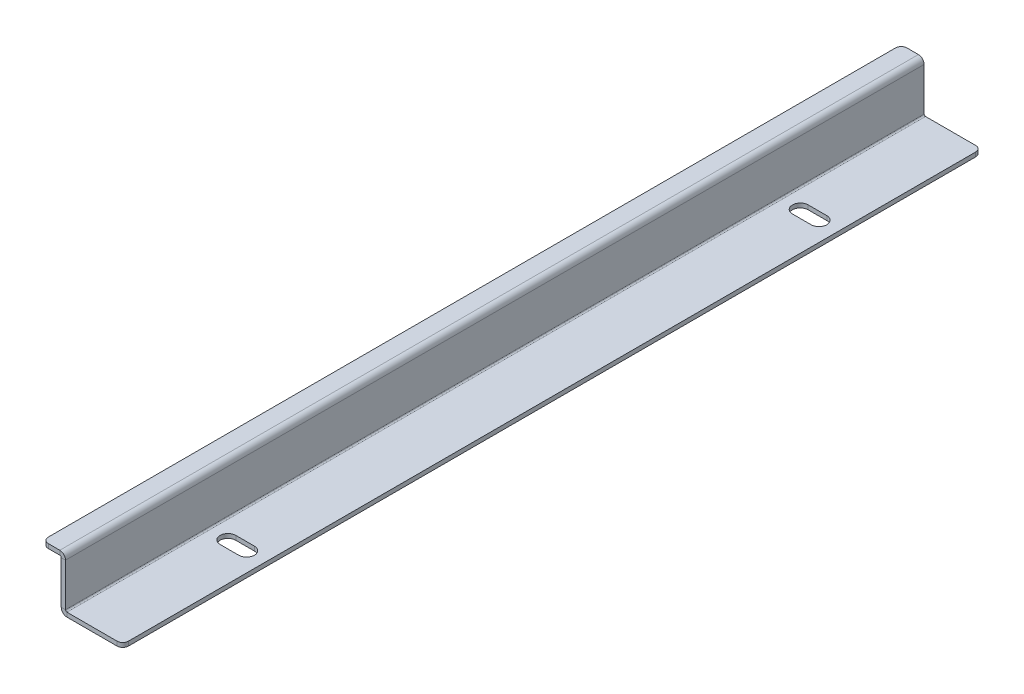
ISO-10303-21;
HEADER;
FILE_DESCRIPTION(('STEP AP214'),'2;1');
FILE_NAME('part.step','',(''),(''),'','','');
FILE_SCHEMA(('AUTOMOTIVE_DESIGN { 1 0 10303 214 1 1 1 1 }'));
ENDSEC;
DATA;
#1=APPLICATION_CONTEXT('core data for automotive mechanical design processes');
#2=APPLICATION_PROTOCOL_DEFINITION('international standard','automotive_design',2000,#1);
#3=PRODUCT_CONTEXT('',#1,'mechanical');
#4=PRODUCT('Part','Part','',(#3));
#5=PRODUCT_RELATED_PRODUCT_CATEGORY('part','',(#4));
#6=PRODUCT_DEFINITION_FORMATION('','',#4);
#7=PRODUCT_DEFINITION_CONTEXT('part definition',#1,'design');
#8=PRODUCT_DEFINITION('design','',#6,#7);
#9=PRODUCT_DEFINITION_SHAPE('','',#8);
#10=(LENGTH_UNIT() NAMED_UNIT(*) SI_UNIT(.MILLI.,.METRE.));
#11=(NAMED_UNIT(*) PLANE_ANGLE_UNIT() SI_UNIT($,.RADIAN.));
#12=(NAMED_UNIT(*) SI_UNIT($,.STERADIAN.) SOLID_ANGLE_UNIT());
#13=UNCERTAINTY_MEASURE_WITH_UNIT(LENGTH_MEASURE(1.E-05),#10,'distance_accuracy_value','');
#14=(GEOMETRIC_REPRESENTATION_CONTEXT(3) GLOBAL_UNCERTAINTY_ASSIGNED_CONTEXT((#13)) GLOBAL_UNIT_ASSIGNED_CONTEXT((#10,
#11,#12)) REPRESENTATION_CONTEXT('',''));
#15=CARTESIAN_POINT('',(0.,0.,0.));
#16=DIRECTION('',(0.,0.,1.));
#17=DIRECTION('',(1.,0.,0.));
#18=AXIS2_PLACEMENT_3D('',#15,#16,#17);
#19=CARTESIAN_POINT('',(0.,-601.6199880024,150.));
#20=DIRECTION('',(-1.,0.,0.));
#21=DIRECTION('',(0.,0.,1.));
#22=AXIS2_PLACEMENT_3D('',#19,#20,#21);
#23=PLANE('',#22);
#24=DIRECTION('',(0.,1.,0.));
#25=VECTOR('',#24,1.);
#26=CARTESIAN_POINT('',(0.,-601.6199880024,148.));
#27=LINE('',#26,#25);
#28=CARTESIAN_POINT('',(0.,-1.50000000000002,148.));
#29=VERTEX_POINT('',#28);
#30=CARTESIAN_POINT('',(0.,0.,148.));
#31=VERTEX_POINT('',#30);
#32=EDGE_CURVE('E425',#29,#31,#27,.T.);
#33=ORIENTED_EDGE('',*,*,#32,.T.);
#34=DIRECTION('',(0.,0.,1.));
#35=VECTOR('',#34,1.);
#36=CARTESIAN_POINT('',(0.,0.,150.));
#37=LINE('',#36,#35);
#38=CARTESIAN_POINT('',(0.,0.,-148.));
#39=VERTEX_POINT('',#38);
#40=EDGE_CURVE('E400',#39,#31,#37,.T.);
#41=ORIENTED_EDGE('',*,*,#40,.F.);
#42=DIRECTION('',(0.,1.,0.));
#43=VECTOR('',#42,1.);
#44=CARTESIAN_POINT('',(0.,-601.6199880024,-148.));
#45=LINE('',#44,#43);
#46=CARTESIAN_POINT('',(0.,-1.50000000000002,-148.));
#47=VERTEX_POINT('',#46);
#48=EDGE_CURVE('E424',#47,#39,#45,.T.);
#49=ORIENTED_EDGE('',*,*,#48,.F.);
#50=DIRECTION('',(0.,0.,1.));
#51=VECTOR('',#50,1.);
#52=CARTESIAN_POINT('',(0.,-1.50000000000001,150.));
#53=LINE('',#52,#51);
#54=EDGE_CURVE('E113',#47,#29,#53,.T.);
#55=ORIENTED_EDGE('',*,*,#54,.T.);
#56=EDGE_LOOP('',(#33,#41,#49,#55));
#57=FACE_BOUND('',#56,.T.);
#58=ADVANCED_FACE('F53',(#57),#23,.T.);
#59=CARTESIAN_POINT('',(2.00000000000001,-601.6199880024,-148.));
#60=DIRECTION('',(0.,1.,0.));
#61=DIRECTION('',(0.,0.,1.));
#62=AXIS2_PLACEMENT_3D('',#59,#60,#61);
#63=CYLINDRICAL_SURFACE('',#62,2.);
#64=ORIENTED_EDGE('',*,*,#48,.T.);
#65=CARTESIAN_POINT('',(2.00000000000001,0.,-148.));
#66=DIRECTION('',(0.,1.,0.));
#67=DIRECTION('',(0.,0.,1.));
#68=AXIS2_PLACEMENT_3D('',#65,#66,#67);
#69=CIRCLE('',#68,2.);
#70=CARTESIAN_POINT('',(2.00000000000001,0.,-150.));
#71=VERTEX_POINT('',#70);
#72=EDGE_CURVE('E396',#71,#39,#69,.T.);
#73=ORIENTED_EDGE('',*,*,#72,.F.);
#74=DIRECTION('',(0.,1.,0.));
#75=VECTOR('',#74,1.);
#76=CARTESIAN_POINT('',(2.00000000000001,-601.6199880024,-150.));
#77=LINE('',#76,#75);
#78=CARTESIAN_POINT('',(2.00000000000001,-1.50000000000002,-150.));
#79=VERTEX_POINT('',#78);
#80=EDGE_CURVE('E438',#79,#71,#77,.T.);
#81=ORIENTED_EDGE('',*,*,#80,.F.);
#82=CARTESIAN_POINT('',(2.00000000000001,-1.50000000000001,-148.));
#83=DIRECTION('',(0.,1.,0.));
#84=DIRECTION('',(0.,0.,1.));
#85=AXIS2_PLACEMENT_3D('',#82,#83,#84);
#86=CIRCLE('',#85,2.);
#87=EDGE_CURVE('E105',#79,#47,#86,.T.);
#88=ORIENTED_EDGE('',*,*,#87,.T.);
#89=EDGE_LOOP('',(#64,#73,#81,#88));
#90=FACE_BOUND('',#89,.T.);
#91=ADVANCED_FACE('F463',(#90),#63,.T.);
#92=CARTESIAN_POINT('',(2.00000000000001,-601.6199880024,148.));
#93=DIRECTION('',(0.,1.,0.));
#94=DIRECTION('',(0.,0.,1.));
#95=AXIS2_PLACEMENT_3D('',#92,#93,#94);
#96=CYLINDRICAL_SURFACE('',#95,2.);
#97=DIRECTION('',(0.,1.,0.));
#98=VECTOR('',#97,1.);
#99=CARTESIAN_POINT('',(2.00000000000001,-601.6199880024,150.));
#100=LINE('',#99,#98);
#101=CARTESIAN_POINT('',(2.00000000000001,-1.50000000000002,150.));
#102=VERTEX_POINT('',#101);
#103=CARTESIAN_POINT('',(2.00000000000001,0.,150.));
#104=VERTEX_POINT('',#103);
#105=EDGE_CURVE('E461',#102,#104,#100,.T.);
#106=ORIENTED_EDGE('',*,*,#105,.T.);
#107=CARTESIAN_POINT('',(2.00000000000001,0.,148.));
#108=DIRECTION('',(0.,-1.,0.));
#109=DIRECTION('',(0.,0.,-1.));
#110=AXIS2_PLACEMENT_3D('',#107,#108,#109);
#111=CIRCLE('',#110,2.);
#112=EDGE_CURVE('E445',#31,#104,#111,.F.);
#113=ORIENTED_EDGE('',*,*,#112,.F.);
#114=ORIENTED_EDGE('',*,*,#32,.F.);
#115=CARTESIAN_POINT('',(2.00000000000001,-1.50000000000001,148.));
#116=DIRECTION('',(0.,-1.,0.));
#117=DIRECTION('',(0.,0.,-1.));
#118=AXIS2_PLACEMENT_3D('',#115,#116,#117);
#119=CIRCLE('',#118,2.);
#120=EDGE_CURVE('E749',#29,#102,#119,.F.);
#121=ORIENTED_EDGE('',*,*,#120,.T.);
#122=EDGE_LOOP('',(#106,#113,#114,#121));
#123=FACE_BOUND('',#122,.T.);
#124=ADVANCED_FACE('F458',(#123),#96,.T.);
#125=CARTESIAN_POINT('',(6.50000000000001,-601.6199880024,150.));
#126=DIRECTION('',(0.,0.,1.));
#127=DIRECTION('',(0.,-1.,0.));
#128=AXIS2_PLACEMENT_3D('',#125,#126,#127);
#129=PLANE('',#128);
#130=DIRECTION('',(0.,1.,0.));
#131=VECTOR('',#130,1.);
#132=CARTESIAN_POINT('',(6.00000000000001,-601.6199880024,150.));
#133=LINE('',#132,#131);
#134=CARTESIAN_POINT('',(6.,-1.5,150.));
#135=VERTEX_POINT('',#134);
#136=CARTESIAN_POINT('',(6.,0.,150.));
#137=VERTEX_POINT('',#136);
#138=EDGE_CURVE('E746',#135,#137,#133,.T.);
#139=ORIENTED_EDGE('',*,*,#138,.T.);
#140=DIRECTION('',(1.,0.,0.));
#141=VECTOR('',#140,1.);
#142=CARTESIAN_POINT('',(6.50000000000001,0.,150.));
#143=LINE('',#142,#141);
#144=EDGE_CURVE('E411',#137,#104,#143,.F.);
#145=ORIENTED_EDGE('',*,*,#144,.T.);
#146=ORIENTED_EDGE('',*,*,#105,.F.);
#147=DIRECTION('',(1.,0.,0.));
#148=VECTOR('',#147,1.);
#149=CARTESIAN_POINT('',(6.50000000000001,-1.50000000000001,150.));
#150=LINE('',#149,#148);
#151=EDGE_CURVE('E406',#102,#135,#150,.T.);
#152=ORIENTED_EDGE('',*,*,#151,.T.);
#153=EDGE_LOOP('',(#139,#145,#146,#152));
#154=FACE_BOUND('',#153,.T.);
#155=ADVANCED_FACE('F474',(#154),#129,.T.);
#156=CARTESIAN_POINT('',(0.,0.,150.));
#157=DIRECTION('',(0.,1.,0.));
#158=DIRECTION('',(0.,0.,1.));
#159=AXIS2_PLACEMENT_3D('',#156,#157,#158);
#160=PLANE('',#159);
#161=ORIENTED_EDGE('',*,*,#144,.F.);
#162=DIRECTION('',(0.,0.,1.));
#163=VECTOR('',#162,1.);
#164=CARTESIAN_POINT('',(6.00000000000001,0.,150.));
#165=LINE('',#164,#163);
#166=CARTESIAN_POINT('',(6.00000000000001,0.,-150.));
#167=VERTEX_POINT('',#166);
#168=EDGE_CURVE('E401',#137,#167,#165,.F.);
#169=ORIENTED_EDGE('',*,*,#168,.T.);
#170=DIRECTION('',(-1.,0.,0.));
#171=VECTOR('',#170,1.);
#172=CARTESIAN_POINT('',(8.50000000000001,0.,-150.));
#173=LINE('',#172,#171);
#174=EDGE_CURVE('E65',#71,#167,#173,.F.);
#175=ORIENTED_EDGE('',*,*,#174,.F.);
#176=ORIENTED_EDGE('',*,*,#72,.T.);
#177=ORIENTED_EDGE('',*,*,#40,.T.);
#178=ORIENTED_EDGE('',*,*,#112,.T.);
#179=EDGE_LOOP('',(#161,#169,#175,#176,#177,#178));
#180=FACE_BOUND('',#179,.T.);
#181=ADVANCED_FACE('F455',(#180),#160,.T.);
#182=CARTESIAN_POINT('',(8.50000000000001,-601.6199880024,-150.));
#183=DIRECTION('',(0.,0.,-1.));
#184=DIRECTION('',(0.,1.,0.));
#185=AXIS2_PLACEMENT_3D('',#182,#183,#184);
#186=PLANE('',#185);
#187=ORIENTED_EDGE('',*,*,#80,.T.);
#188=ORIENTED_EDGE('',*,*,#174,.T.);
#189=DIRECTION('',(0.,1.,0.));
#190=VECTOR('',#189,1.);
#191=CARTESIAN_POINT('',(6.00000000000001,-601.6199880024,-150.));
#192=LINE('',#191,#190);
#193=CARTESIAN_POINT('',(6.00000000000001,-1.5,-150.));
#194=VERTEX_POINT('',#193);
#195=EDGE_CURVE('E297',#194,#167,#192,.T.);
#196=ORIENTED_EDGE('',*,*,#195,.F.);
#197=DIRECTION('',(-1.,0.,0.));
#198=VECTOR('',#197,1.);
#199=CARTESIAN_POINT('',(8.50000000000001,-1.50000000000001,-150.));
#200=LINE('',#199,#198);
#201=EDGE_CURVE('E12',#194,#79,#200,.T.);
#202=ORIENTED_EDGE('',*,*,#201,.T.);
#203=EDGE_LOOP('',(#187,#188,#196,#202));
#204=FACE_BOUND('',#203,.T.);
#205=ADVANCED_FACE('F437',(#204),#186,.T.);
#206=CARTESIAN_POINT('',(0.,-1.50000000000001,150.));
#207=DIRECTION('',(0.,1.,0.));
#208=DIRECTION('',(0.,0.,1.));
#209=AXIS2_PLACEMENT_3D('',#206,#207,#208);
#210=PLANE('',#209);
#211=ORIENTED_EDGE('',*,*,#151,.F.);
#212=ORIENTED_EDGE('',*,*,#120,.F.);
#213=ORIENTED_EDGE('',*,*,#54,.F.);
#214=ORIENTED_EDGE('',*,*,#87,.F.);
#215=ORIENTED_EDGE('',*,*,#201,.F.);
#216=DIRECTION('',(0.,0.,1.));
#217=VECTOR('',#216,1.);
#218=CARTESIAN_POINT('',(6.00000000000001,-1.50000000000001,150.));
#219=LINE('',#218,#217);
#220=EDGE_CURVE('E58',#135,#194,#219,.F.);
#221=ORIENTED_EDGE('',*,*,#220,.F.);
#222=EDGE_LOOP('',(#211,#212,#213,#214,#215,#221));
#223=FACE_BOUND('',#222,.T.);
#224=ADVANCED_FACE('F56',(#223),#210,.F.);
#225=CARTESIAN_POINT('',(6.50000000000001,0.,150.));
#226=DIRECTION('',(1.,0.,0.));
#227=DIRECTION('',(0.,0.,-1.));
#228=AXIS2_PLACEMENT_3D('',#225,#226,#227);
#229=PLANE('',#228);
#230=DIRECTION('',(0.,1.,0.));
#231=VECTOR('',#230,1.);
#232=CARTESIAN_POINT('',(6.5,-17.,-150.));
#233=LINE('',#232,#231);
#234=CARTESIAN_POINT('',(6.5,-17.,-150.));
#235=VERTEX_POINT('',#234);
#236=CARTESIAN_POINT('',(6.50000000000001,-2.,-150.));
#237=VERTEX_POINT('',#236);
#238=EDGE_CURVE('E304',#235,#237,#233,.T.);
#239=ORIENTED_EDGE('',*,*,#238,.F.);
#240=DIRECTION('',(0.,0.,-1.));
#241=VECTOR('',#240,1.);
#242=CARTESIAN_POINT('',(6.5,-17.,150.));
#243=LINE('',#242,#241);
#244=CARTESIAN_POINT('',(6.5,-17.,150.));
#245=VERTEX_POINT('',#244);
#246=EDGE_CURVE('E513',#245,#235,#243,.T.);
#247=ORIENTED_EDGE('',*,*,#246,.F.);
#248=DIRECTION('',(0.,1.,0.));
#249=VECTOR('',#248,1.);
#250=CARTESIAN_POINT('',(6.5,-17.,150.));
#251=LINE('',#250,#249);
#252=CARTESIAN_POINT('',(6.50000000000001,-2.,150.));
#253=VERTEX_POINT('',#252);
#254=EDGE_CURVE('E317',#253,#245,#251,.F.);
#255=ORIENTED_EDGE('',*,*,#254,.F.);
#256=DIRECTION('',(0.,0.,-1.));
#257=VECTOR('',#256,1.);
#258=CARTESIAN_POINT('',(6.50000000000001,-2.,150.));
#259=LINE('',#258,#257);
#260=EDGE_CURVE('E314',#237,#253,#259,.F.);
#261=ORIENTED_EDGE('',*,*,#260,.F.);
#262=EDGE_LOOP('',(#239,#247,#255,#261));
#263=FACE_BOUND('',#262,.T.);
#264=ADVANCED_FACE('F485',(#263),#229,.F.);
#265=CARTESIAN_POINT('',(607.249531835024,-17.,-150.));
#266=DIRECTION('',(0.,0.,-1.));
#267=DIRECTION('',(0.,1.,0.));
#268=AXIS2_PLACEMENT_3D('',#265,#266,#267);
#269=PLANE('',#268);
#270=ORIENTED_EDGE('',*,*,#238,.T.);
#271=DIRECTION('',(-1.,0.,0.));
#272=VECTOR('',#271,1.);
#273=CARTESIAN_POINT('',(607.249531835024,-2.,-150.));
#274=LINE('',#273,#272);
#275=CARTESIAN_POINT('',(8.00000000000001,-2.00000000000001,-150.));
#276=VERTEX_POINT('',#275);
#277=EDGE_CURVE('E295',#276,#237,#274,.T.);
#278=ORIENTED_EDGE('',*,*,#277,.F.);
#279=DIRECTION('',(0.,1.,0.));
#280=VECTOR('',#279,1.);
#281=CARTESIAN_POINT('',(8.,-17.,-150.));
#282=LINE('',#281,#280);
#283=CARTESIAN_POINT('',(8.,-17.,-150.));
#284=VERTEX_POINT('',#283);
#285=EDGE_CURVE('E125',#276,#284,#282,.F.);
#286=ORIENTED_EDGE('',*,*,#285,.T.);
#287=DIRECTION('',(-1.,0.,0.));
#288=VECTOR('',#287,1.);
#289=CARTESIAN_POINT('',(607.249531835024,-17.,-150.));
#290=LINE('',#289,#288);
#291=EDGE_CURVE('E520',#284,#235,#290,.T.);
#292=ORIENTED_EDGE('',*,*,#291,.T.);
#293=EDGE_LOOP('',(#270,#278,#286,#292));
#294=FACE_BOUND('',#293,.T.);
#295=ADVANCED_FACE('F302',(#294),#269,.T.);
#296=CARTESIAN_POINT('',(607.249531835024,-17.,150.));
#297=DIRECTION('',(0.,0.,1.));
#298=DIRECTION('',(0.,-1.,0.));
#299=AXIS2_PLACEMENT_3D('',#296,#297,#298);
#300=PLANE('',#299);
#301=ORIENTED_EDGE('',*,*,#254,.T.);
#302=DIRECTION('',(-1.,0.,0.));
#303=VECTOR('',#302,1.);
#304=CARTESIAN_POINT('',(607.249531835024,-17.,150.));
#305=LINE('',#304,#303);
#306=CARTESIAN_POINT('',(8.,-17.,150.));
#307=VERTEX_POINT('',#306);
#308=EDGE_CURVE('E511',#307,#245,#305,.T.);
#309=ORIENTED_EDGE('',*,*,#308,.F.);
#310=DIRECTION('',(0.,1.,0.));
#311=VECTOR('',#310,1.);
#312=CARTESIAN_POINT('',(8.,-17.,150.));
#313=LINE('',#312,#311);
#314=CARTESIAN_POINT('',(8.00000000000001,-2.,150.));
#315=VERTEX_POINT('',#314);
#316=EDGE_CURVE('E291',#307,#315,#313,.T.);
#317=ORIENTED_EDGE('',*,*,#316,.T.);
#318=DIRECTION('',(-1.,0.,0.));
#319=VECTOR('',#318,1.);
#320=CARTESIAN_POINT('',(607.249531835024,-2.,150.));
#321=LINE('',#320,#319);
#322=EDGE_CURVE('E307',#315,#253,#321,.T.);
#323=ORIENTED_EDGE('',*,*,#322,.T.);
#324=EDGE_LOOP('',(#301,#309,#317,#323));
#325=FACE_BOUND('',#324,.T.);
#326=ADVANCED_FACE('F494',(#325),#300,.T.);
#327=CARTESIAN_POINT('',(8.,0.,150.));
#328=DIRECTION('',(1.,0.,0.));
#329=DIRECTION('',(0.,0.,-1.));
#330=AXIS2_PLACEMENT_3D('',#327,#328,#329);
#331=PLANE('',#330);
#332=ORIENTED_EDGE('',*,*,#285,.F.);
#333=DIRECTION('',(0.,0.,-1.));
#334=VECTOR('',#333,1.);
#335=CARTESIAN_POINT('',(8.,-2.,150.));
#336=LINE('',#335,#334);
#337=EDGE_CURVE('E280',#315,#276,#336,.T.);
#338=ORIENTED_EDGE('',*,*,#337,.F.);
#339=ORIENTED_EDGE('',*,*,#316,.F.);
#340=DIRECTION('',(0.,0.,-1.));
#341=VECTOR('',#340,1.);
#342=CARTESIAN_POINT('',(8.,-17.,150.));
#343=LINE('',#342,#341);
#344=EDGE_CURVE('E311',#307,#284,#343,.T.);
#345=ORIENTED_EDGE('',*,*,#344,.T.);
#346=EDGE_LOOP('',(#332,#338,#339,#345));
#347=FACE_BOUND('',#346,.T.);
#348=ADVANCED_FACE('F309',(#347),#331,.T.);
#349=CARTESIAN_POINT('',(28.,582.266164023887,150.));
#350=DIRECTION('',(-1.,0.,0.));
#351=DIRECTION('',(0.,0.,1.));
#352=AXIS2_PLACEMENT_3D('',#349,#350,#351);
#353=PLANE('',#352);
#354=DIRECTION('',(0.,-1.,0.));
#355=VECTOR('',#354,1.);
#356=CARTESIAN_POINT('',(28.,582.266164023887,148.));
#357=LINE('',#356,#355);
#358=CARTESIAN_POINT('',(28.,-17.5,148.));
#359=VERTEX_POINT('',#358);
#360=CARTESIAN_POINT('',(28.,-19.,148.));
#361=VERTEX_POINT('',#360);
#362=EDGE_CURVE('E543',#359,#361,#357,.T.);
#363=ORIENTED_EDGE('',*,*,#362,.T.);
#364=DIRECTION('',(0.,0.,-1.));
#365=VECTOR('',#364,1.);
#366=CARTESIAN_POINT('',(28.,-19.,150.));
#367=LINE('',#366,#365);
#368=CARTESIAN_POINT('',(28.,-19.,-148.));
#369=VERTEX_POINT('',#368);
#370=EDGE_CURVE('E608',#361,#369,#367,.T.);
#371=ORIENTED_EDGE('',*,*,#370,.T.);
#372=DIRECTION('',(0.,-1.,0.));
#373=VECTOR('',#372,1.);
#374=CARTESIAN_POINT('',(28.,582.266164023887,-148.));
#375=LINE('',#374,#373);
#376=CARTESIAN_POINT('',(28.,-17.5,-148.));
#377=VERTEX_POINT('',#376);
#378=EDGE_CURVE('E565',#377,#369,#375,.T.);
#379=ORIENTED_EDGE('',*,*,#378,.F.);
#380=DIRECTION('',(0.,0.,1.));
#381=VECTOR('',#380,1.);
#382=CARTESIAN_POINT('',(28.,-17.5,150.));
#383=LINE('',#382,#381);
#384=EDGE_CURVE('E644',#359,#377,#383,.F.);
#385=ORIENTED_EDGE('',*,*,#384,.F.);
#386=EDGE_LOOP('',(#363,#371,#379,#385));
#387=FACE_BOUND('',#386,.T.);
#388=ADVANCED_FACE('F502',(#387),#353,.F.);
#389=CARTESIAN_POINT('',(26.,582.266164023887,148.));
#390=DIRECTION('',(0.,-1.,0.));
#391=DIRECTION('',(0.,0.,-1.));
#392=AXIS2_PLACEMENT_3D('',#389,#390,#391);
#393=CYLINDRICAL_SURFACE('',#392,2.);
#394=DIRECTION('',(0.,-1.,0.));
#395=VECTOR('',#394,1.);
#396=CARTESIAN_POINT('',(26.,582.266164023887,150.));
#397=LINE('',#396,#395);
#398=CARTESIAN_POINT('',(26.,-17.5,150.));
#399=VERTEX_POINT('',#398);
#400=CARTESIAN_POINT('',(26.,-19.,150.));
#401=VERTEX_POINT('',#400);
#402=EDGE_CURVE('E605',#399,#401,#397,.T.);
#403=ORIENTED_EDGE('',*,*,#402,.T.);
#404=CARTESIAN_POINT('',(26.,-19.,148.));
#405=DIRECTION('',(0.,-1.,0.));
#406=DIRECTION('',(0.,0.,-1.));
#407=AXIS2_PLACEMENT_3D('',#404,#405,#406);
#408=CIRCLE('',#407,2.);
#409=EDGE_CURVE('E601',#401,#361,#408,.F.);
#410=ORIENTED_EDGE('',*,*,#409,.T.);
#411=ORIENTED_EDGE('',*,*,#362,.F.);
#412=CARTESIAN_POINT('',(26.,-17.5,148.));
#413=DIRECTION('',(0.,-1.,0.));
#414=DIRECTION('',(0.,0.,-1.));
#415=AXIS2_PLACEMENT_3D('',#412,#413,#414);
#416=CIRCLE('',#415,2.);
#417=EDGE_CURVE('E647',#399,#359,#416,.F.);
#418=ORIENTED_EDGE('',*,*,#417,.F.);
#419=EDGE_LOOP('',(#403,#410,#411,#418));
#420=FACE_BOUND('',#419,.T.);
#421=ADVANCED_FACE('F784',(#420),#393,.T.);
#422=CARTESIAN_POINT('',(14.75,-17.5,-102.75));
#423=DIRECTION('',(0.,0.,-1.));
#424=DIRECTION('',(-1.,0.,0.));
#425=AXIS2_PLACEMENT_3D('',#422,#423,#424);
#426=PLANE('',#425);
#427=DIRECTION('',(0.,1.,0.));
#428=VECTOR('',#427,1.);
#429=CARTESIAN_POINT('',(21.25,-17.5,-102.75));
#430=LINE('',#429,#428);
#431=CARTESIAN_POINT('',(21.25,-19.,-102.75));
#432=VERTEX_POINT('',#431);
#433=CARTESIAN_POINT('',(21.25,-17.5,-102.75));
#434=VERTEX_POINT('',#433);
#435=EDGE_CURVE('E597',#432,#434,#430,.T.);
#436=ORIENTED_EDGE('',*,*,#435,.T.);
#437=DIRECTION('',(1.,0.,0.));
#438=VECTOR('',#437,1.);
#439=CARTESIAN_POINT('',(8.,-17.5,-102.75));
#440=LINE('',#439,#438);
#441=CARTESIAN_POINT('',(14.75,-17.5,-102.75));
#442=VERTEX_POINT('',#441);
#443=EDGE_CURVE('E655',#442,#434,#440,.T.);
#444=ORIENTED_EDGE('',*,*,#443,.F.);
#445=DIRECTION('',(0.,1.,0.));
#446=VECTOR('',#445,1.);
#447=CARTESIAN_POINT('',(14.75,-17.5,-102.75));
#448=LINE('',#447,#446);
#449=CARTESIAN_POINT('',(14.75,-19.,-102.75));
#450=VERTEX_POINT('',#449);
#451=EDGE_CURVE('E589',#450,#442,#448,.T.);
#452=ORIENTED_EDGE('',*,*,#451,.F.);
#453=DIRECTION('',(-1.,0.,0.));
#454=VECTOR('',#453,1.);
#455=CARTESIAN_POINT('',(14.75,-19.,-102.75));
#456=LINE('',#455,#454);
#457=EDGE_CURVE('E355',#432,#450,#456,.T.);
#458=ORIENTED_EDGE('',*,*,#457,.F.);
#459=EDGE_LOOP('',(#436,#444,#452,#458));
#460=FACE_BOUND('',#459,.T.);
#461=ADVANCED_FACE('F788',(#460),#426,.F.);
#462=CARTESIAN_POINT('',(14.75,-17.5,-100.));
#463=DIRECTION('',(0.,1.,0.));
#464=DIRECTION('',(0.,0.,1.));
#465=AXIS2_PLACEMENT_3D('',#462,#463,#464);
#466=CYLINDRICAL_SURFACE('',#465,2.74999999999999);
#467=CARTESIAN_POINT('',(14.75,-17.5,-100.));
#468=DIRECTION('',(0.,1.,0.));
#469=DIRECTION('',(0.,0.,1.));
#470=AXIS2_PLACEMENT_3D('',#467,#468,#469);
#471=CIRCLE('',#470,2.74999999999999);
#472=CARTESIAN_POINT('',(14.75,-17.5,-97.25));
#473=VERTEX_POINT('',#472);
#474=EDGE_CURVE('E659',#473,#442,#471,.F.);
#475=ORIENTED_EDGE('',*,*,#474,.F.);
#476=DIRECTION('',(0.,1.,0.));
#477=VECTOR('',#476,1.);
#478=CARTESIAN_POINT('',(14.75,-17.5,-97.25));
#479=LINE('',#478,#477);
#480=CARTESIAN_POINT('',(14.75,-19.,-97.25));
#481=VERTEX_POINT('',#480);
#482=EDGE_CURVE('E593',#473,#481,#479,.F.);
#483=ORIENTED_EDGE('',*,*,#482,.T.);
#484=CARTESIAN_POINT('',(14.75,-19.,-100.));
#485=DIRECTION('',(0.,1.,0.));
#486=DIRECTION('',(0.,0.,1.));
#487=AXIS2_PLACEMENT_3D('',#484,#485,#486);
#488=CIRCLE('',#487,2.74999999999999);
#489=EDGE_CURVE('E625',#450,#481,#488,.T.);
#490=ORIENTED_EDGE('',*,*,#489,.F.);
#491=ORIENTED_EDGE('',*,*,#451,.T.);
#492=EDGE_LOOP('',(#475,#483,#490,#491));
#493=FACE_BOUND('',#492,.T.);
#494=ADVANCED_FACE('F792',(#493),#466,.F.);
#495=CARTESIAN_POINT('',(14.75,-17.5,-97.25));
#496=DIRECTION('',(0.,0.,1.));
#497=DIRECTION('',(1.,0.,0.));
#498=AXIS2_PLACEMENT_3D('',#495,#496,#497);
#499=PLANE('',#498);
#500=DIRECTION('',(0.,1.,0.));
#501=VECTOR('',#500,1.);
#502=CARTESIAN_POINT('',(21.25,-17.5,-97.25));
#503=LINE('',#502,#501);
#504=CARTESIAN_POINT('',(21.25,-19.,-97.25));
#505=VERTEX_POINT('',#504);
#506=CARTESIAN_POINT('',(21.25,-17.5,-97.25));
#507=VERTEX_POINT('',#506);
#508=EDGE_CURVE('E585',#505,#507,#503,.T.);
#509=ORIENTED_EDGE('',*,*,#508,.F.);
#510=DIRECTION('',(1.,0.,0.));
#511=VECTOR('',#510,1.);
#512=CARTESIAN_POINT('',(14.75,-19.,-97.25));
#513=LINE('',#512,#511);
#514=EDGE_CURVE('E623',#481,#505,#513,.T.);
#515=ORIENTED_EDGE('',*,*,#514,.F.);
#516=ORIENTED_EDGE('',*,*,#482,.F.);
#517=DIRECTION('',(1.,0.,0.));
#518=VECTOR('',#517,1.);
#519=CARTESIAN_POINT('',(8.,-17.5,-97.25));
#520=LINE('',#519,#518);
#521=EDGE_CURVE('E662',#507,#473,#520,.F.);
#522=ORIENTED_EDGE('',*,*,#521,.F.);
#523=EDGE_LOOP('',(#509,#515,#516,#522));
#524=FACE_BOUND('',#523,.T.);
#525=ADVANCED_FACE('F796',(#524),#499,.F.);
#526=CARTESIAN_POINT('',(21.25,-17.5,-100.));
#527=DIRECTION('',(0.,1.,0.));
#528=DIRECTION('',(0.,0.,1.));
#529=AXIS2_PLACEMENT_3D('',#526,#527,#528);
#530=CYLINDRICAL_SURFACE('',#529,2.74999999999999);
#531=CARTESIAN_POINT('',(21.25,-19.,-100.));
#532=DIRECTION('',(0.,1.,0.));
#533=DIRECTION('',(0.,0.,1.));
#534=AXIS2_PLACEMENT_3D('',#531,#532,#533);
#535=CIRCLE('',#534,2.74999999999999);
#536=EDGE_CURVE('E360',#505,#432,#535,.T.);
#537=ORIENTED_EDGE('',*,*,#536,.F.);
#538=ORIENTED_EDGE('',*,*,#508,.T.);
#539=CARTESIAN_POINT('',(21.25,-17.5,-100.));
#540=DIRECTION('',(0.,1.,0.));
#541=DIRECTION('',(0.,0.,1.));
#542=AXIS2_PLACEMENT_3D('',#539,#540,#541);
#543=CIRCLE('',#542,2.74999999999999);
#544=EDGE_CURVE('E665',#434,#507,#543,.F.);
#545=ORIENTED_EDGE('',*,*,#544,.F.);
#546=ORIENTED_EDGE('',*,*,#435,.F.);
#547=EDGE_LOOP('',(#537,#538,#545,#546));
#548=FACE_BOUND('',#547,.T.);
#549=ADVANCED_FACE('F800',(#548),#530,.F.);
#550=CARTESIAN_POINT('',(21.25,-17.5,100.));
#551=DIRECTION('',(0.,1.,0.));
#552=DIRECTION('',(0.,0.,1.));
#553=AXIS2_PLACEMENT_3D('',#550,#551,#552);
#554=CYLINDRICAL_SURFACE('',#553,2.74999999999999);
#555=CARTESIAN_POINT('',(21.25,-19.,100.));
#556=DIRECTION('',(0.,1.,0.));
#557=DIRECTION('',(0.,0.,1.));
#558=AXIS2_PLACEMENT_3D('',#555,#556,#557);
#559=CIRCLE('',#558,2.74999999999999);
#560=CARTESIAN_POINT('',(21.25,-19.,102.75));
#561=VERTEX_POINT('',#560);
#562=CARTESIAN_POINT('',(21.25,-19.,97.25));
#563=VERTEX_POINT('',#562);
#564=EDGE_CURVE('E634',#561,#563,#559,.T.);
#565=ORIENTED_EDGE('',*,*,#564,.F.);
#566=DIRECTION('',(0.,1.,0.));
#567=VECTOR('',#566,1.);
#568=CARTESIAN_POINT('',(21.25,-17.5,102.75));
#569=LINE('',#568,#567);
#570=CARTESIAN_POINT('',(21.25,-17.5,102.75));
#571=VERTEX_POINT('',#570);
#572=EDGE_CURVE('E581',#561,#571,#569,.T.);
#573=ORIENTED_EDGE('',*,*,#572,.T.);
#574=CARTESIAN_POINT('',(21.25,-17.5,100.));
#575=DIRECTION('',(0.,1.,0.));
#576=DIRECTION('',(0.,0.,1.));
#577=AXIS2_PLACEMENT_3D('',#574,#575,#576);
#578=CIRCLE('',#577,2.74999999999999);
#579=CARTESIAN_POINT('',(21.25,-17.5,97.25));
#580=VERTEX_POINT('',#579);
#581=EDGE_CURVE('E668',#580,#571,#578,.F.);
#582=ORIENTED_EDGE('',*,*,#581,.F.);
#583=DIRECTION('',(0.,1.,0.));
#584=VECTOR('',#583,1.);
#585=CARTESIAN_POINT('',(21.25,-17.5,97.25));
#586=LINE('',#585,#584);
#587=EDGE_CURVE('E577',#563,#580,#586,.T.);
#588=ORIENTED_EDGE('',*,*,#587,.F.);
#589=EDGE_LOOP('',(#565,#573,#582,#588));
#590=FACE_BOUND('',#589,.T.);
#591=ADVANCED_FACE('F702',(#590),#554,.F.);
#592=CARTESIAN_POINT('',(14.75,-17.5,97.25));
#593=DIRECTION('',(0.,0.,-1.));
#594=DIRECTION('',(-1.,0.,0.));
#595=AXIS2_PLACEMENT_3D('',#592,#593,#594);
#596=PLANE('',#595);
#597=ORIENTED_EDGE('',*,*,#587,.T.);
#598=DIRECTION('',(1.,0.,0.));
#599=VECTOR('',#598,1.);
#600=CARTESIAN_POINT('',(8.,-17.5,97.25));
#601=LINE('',#600,#599);
#602=CARTESIAN_POINT('',(14.75,-17.5,97.25));
#603=VERTEX_POINT('',#602);
#604=EDGE_CURVE('E672',#603,#580,#601,.T.);
#605=ORIENTED_EDGE('',*,*,#604,.F.);
#606=DIRECTION('',(0.,1.,0.));
#607=VECTOR('',#606,1.);
#608=CARTESIAN_POINT('',(14.75,-17.5,97.25));
#609=LINE('',#608,#607);
#610=CARTESIAN_POINT('',(14.75,-19.,97.25));
#611=VERTEX_POINT('',#610);
#612=EDGE_CURVE('E573',#603,#611,#609,.F.);
#613=ORIENTED_EDGE('',*,*,#612,.T.);
#614=DIRECTION('',(-1.,0.,0.));
#615=VECTOR('',#614,1.);
#616=CARTESIAN_POINT('',(14.75,-19.,97.25));
#617=LINE('',#616,#615);
#618=EDGE_CURVE('E631',#563,#611,#617,.T.);
#619=ORIENTED_EDGE('',*,*,#618,.F.);
#620=EDGE_LOOP('',(#597,#605,#613,#619));
#621=FACE_BOUND('',#620,.T.);
#622=ADVANCED_FACE('F692',(#621),#596,.F.);
#623=CARTESIAN_POINT('',(14.75,-17.5,100.));
#624=DIRECTION('',(0.,1.,0.));
#625=DIRECTION('',(0.,0.,1.));
#626=AXIS2_PLACEMENT_3D('',#623,#624,#625);
#627=CYLINDRICAL_SURFACE('',#626,2.74999999999999);
#628=CARTESIAN_POINT('',(14.75,-17.5,100.));
#629=DIRECTION('',(0.,1.,0.));
#630=DIRECTION('',(0.,0.,1.));
#631=AXIS2_PLACEMENT_3D('',#628,#629,#630);
#632=CIRCLE('',#631,2.74999999999999);
#633=CARTESIAN_POINT('',(14.75,-17.5,102.75));
#634=VERTEX_POINT('',#633);
#635=EDGE_CURVE('E556',#634,#603,#632,.F.);
#636=ORIENTED_EDGE('',*,*,#635,.F.);
#637=DIRECTION('',(0.,1.,0.));
#638=VECTOR('',#637,1.);
#639=CARTESIAN_POINT('',(14.75,-17.5,102.75));
#640=LINE('',#639,#638);
#641=CARTESIAN_POINT('',(14.75,-19.,102.75));
#642=VERTEX_POINT('',#641);
#643=EDGE_CURVE('E569',#642,#634,#640,.T.);
#644=ORIENTED_EDGE('',*,*,#643,.F.);
#645=CARTESIAN_POINT('',(14.75,-19.,100.));
#646=DIRECTION('',(0.,1.,0.));
#647=DIRECTION('',(0.,0.,1.));
#648=AXIS2_PLACEMENT_3D('',#645,#646,#647);
#649=CIRCLE('',#648,2.74999999999999);
#650=EDGE_CURVE('E627',#611,#642,#649,.T.);
#651=ORIENTED_EDGE('',*,*,#650,.F.);
#652=ORIENTED_EDGE('',*,*,#612,.F.);
#653=EDGE_LOOP('',(#636,#644,#651,#652));
#654=FACE_BOUND('',#653,.T.);
#655=ADVANCED_FACE('F696',(#654),#627,.F.);
#656=CARTESIAN_POINT('',(14.75,-17.5,102.75));
#657=DIRECTION('',(0.,0.,1.));
#658=DIRECTION('',(1.,0.,0.));
#659=AXIS2_PLACEMENT_3D('',#656,#657,#658);
#660=PLANE('',#659);
#661=ORIENTED_EDGE('',*,*,#572,.F.);
#662=DIRECTION('',(1.,0.,0.));
#663=VECTOR('',#662,1.);
#664=CARTESIAN_POINT('',(14.75,-19.,102.75));
#665=LINE('',#664,#663);
#666=EDGE_CURVE('E377',#642,#561,#665,.T.);
#667=ORIENTED_EDGE('',*,*,#666,.F.);
#668=ORIENTED_EDGE('',*,*,#643,.T.);
#669=DIRECTION('',(1.,0.,0.));
#670=VECTOR('',#669,1.);
#671=CARTESIAN_POINT('',(8.,-17.5,102.75));
#672=LINE('',#671,#670);
#673=EDGE_CURVE('E553',#571,#634,#672,.F.);
#674=ORIENTED_EDGE('',*,*,#673,.F.);
#675=EDGE_LOOP('',(#661,#667,#668,#674));
#676=FACE_BOUND('',#675,.T.);
#677=ADVANCED_FACE('F704',(#676),#660,.F.);
#678=CARTESIAN_POINT('',(26.,582.266164023887,-148.));
#679=DIRECTION('',(0.,-1.,0.));
#680=DIRECTION('',(0.,0.,-1.));
#681=AXIS2_PLACEMENT_3D('',#678,#679,#680);
#682=CYLINDRICAL_SURFACE('',#681,2.);
#683=ORIENTED_EDGE('',*,*,#378,.T.);
#684=CARTESIAN_POINT('',(26.,-19.,-148.));
#685=DIRECTION('',(0.,-1.,0.));
#686=DIRECTION('',(0.,0.,-1.));
#687=AXIS2_PLACEMENT_3D('',#684,#685,#686);
#688=CIRCLE('',#687,2.);
#689=CARTESIAN_POINT('',(26.,-19.,-150.));
#690=VERTEX_POINT('',#689);
#691=EDGE_CURVE('E558',#369,#690,#688,.F.);
#692=ORIENTED_EDGE('',*,*,#691,.T.);
#693=DIRECTION('',(0.,-1.,0.));
#694=VECTOR('',#693,1.);
#695=CARTESIAN_POINT('',(26.,582.266164023887,-150.));
#696=LINE('',#695,#694);
#697=CARTESIAN_POINT('',(26.,-17.5,-150.));
#698=VERTEX_POINT('',#697);
#699=EDGE_CURVE('E551',#698,#690,#696,.T.);
#700=ORIENTED_EDGE('',*,*,#699,.F.);
#701=CARTESIAN_POINT('',(26.,-17.5,-148.));
#702=DIRECTION('',(0.,-1.,0.));
#703=DIRECTION('',(0.,0.,-1.));
#704=AXIS2_PLACEMENT_3D('',#701,#702,#703);
#705=CIRCLE('',#704,2.);
#706=EDGE_CURVE('E641',#377,#698,#705,.F.);
#707=ORIENTED_EDGE('',*,*,#706,.F.);
#708=EDGE_LOOP('',(#683,#692,#700,#707));
#709=FACE_BOUND('',#708,.T.);
#710=ADVANCED_FACE('F706',(#709),#682,.T.);
#711=CARTESIAN_POINT('',(8.,582.266164023887,-150.));
#712=DIRECTION('',(0.,0.,1.));
#713=DIRECTION('',(1.,0.,0.));
#714=AXIS2_PLACEMENT_3D('',#711,#712,#713);
#715=PLANE('',#714);
#716=ORIENTED_EDGE('',*,*,#699,.T.);
#717=DIRECTION('',(-1.,0.,0.));
#718=VECTOR('',#717,1.);
#719=CARTESIAN_POINT('',(8.5,-19.,-150.));
#720=LINE('',#719,#718);
#721=CARTESIAN_POINT('',(8.5,-19.,-150.));
#722=VERTEX_POINT('',#721);
#723=EDGE_CURVE('E540',#690,#722,#720,.T.);
#724=ORIENTED_EDGE('',*,*,#723,.T.);
#725=DIRECTION('',(0.,-1.,0.));
#726=VECTOR('',#725,1.);
#727=CARTESIAN_POINT('',(8.5,582.266164023887,-150.));
#728=LINE('',#727,#726);
#729=CARTESIAN_POINT('',(8.5,-17.5,-150.));
#730=VERTEX_POINT('',#729);
#731=EDGE_CURVE('E531',#730,#722,#728,.T.);
#732=ORIENTED_EDGE('',*,*,#731,.F.);
#733=DIRECTION('',(1.,0.,0.));
#734=VECTOR('',#733,1.);
#735=CARTESIAN_POINT('',(8.,-17.5,-150.));
#736=LINE('',#735,#734);
#737=EDGE_CURVE('E389',#698,#730,#736,.F.);
#738=ORIENTED_EDGE('',*,*,#737,.F.);
#739=EDGE_LOOP('',(#716,#724,#732,#738));
#740=FACE_BOUND('',#739,.T.);
#741=ADVANCED_FACE('F548',(#740),#715,.F.);
#742=CARTESIAN_POINT('',(8.,-17.5,150.));
#743=DIRECTION('',(0.,1.,0.));
#744=DIRECTION('',(0.,0.,1.));
#745=AXIS2_PLACEMENT_3D('',#742,#743,#744);
#746=PLANE('',#745);
#747=ORIENTED_EDGE('',*,*,#673,.T.);
#748=ORIENTED_EDGE('',*,*,#635,.T.);
#749=ORIENTED_EDGE('',*,*,#604,.T.);
#750=ORIENTED_EDGE('',*,*,#581,.T.);
#751=EDGE_LOOP('',(#747,#748,#749,#750));
#752=FACE_BOUND('',#751,.T.);
#753=ORIENTED_EDGE('',*,*,#544,.T.);
#754=ORIENTED_EDGE('',*,*,#521,.T.);
#755=ORIENTED_EDGE('',*,*,#474,.T.);
#756=ORIENTED_EDGE('',*,*,#443,.T.);
#757=EDGE_LOOP('',(#753,#754,#755,#756));
#758=FACE_BOUND('',#757,.T.);
#759=DIRECTION('',(1.,0.,0.));
#760=VECTOR('',#759,1.);
#761=CARTESIAN_POINT('',(8.,-17.5,150.));
#762=LINE('',#761,#760);
#763=CARTESIAN_POINT('',(8.5,-17.5,150.));
#764=VERTEX_POINT('',#763);
#765=EDGE_CURVE('E651',#764,#399,#762,.T.);
#766=ORIENTED_EDGE('',*,*,#765,.T.);
#767=ORIENTED_EDGE('',*,*,#417,.T.);
#768=ORIENTED_EDGE('',*,*,#384,.T.);
#769=ORIENTED_EDGE('',*,*,#706,.T.);
#770=ORIENTED_EDGE('',*,*,#737,.T.);
#771=DIRECTION('',(0.,0.,1.));
#772=VECTOR('',#771,1.);
#773=CARTESIAN_POINT('',(8.5,-17.5,150.));
#774=LINE('',#773,#772);
#775=EDGE_CURVE('E384',#730,#764,#774,.T.);
#776=ORIENTED_EDGE('',*,*,#775,.T.);
#777=EDGE_LOOP('',(#766,#767,#768,#769,#770,#776));
#778=FACE_BOUND('',#777,.T.);
#779=ADVANCED_FACE('F685',(#752,#758,#778),#746,.T.);
#780=CARTESIAN_POINT('',(8.,582.266164023887,150.));
#781=DIRECTION('',(0.,0.,-1.));
#782=DIRECTION('',(-1.,0.,0.));
#783=AXIS2_PLACEMENT_3D('',#780,#781,#782);
#784=PLANE('',#783);
#785=DIRECTION('',(0.,-1.,0.));
#786=VECTOR('',#785,1.);
#787=CARTESIAN_POINT('',(8.5,582.266164023887,150.));
#788=LINE('',#787,#786);
#789=CARTESIAN_POINT('',(8.5,-19.,150.));
#790=VERTEX_POINT('',#789);
#791=EDGE_CURVE('E378',#764,#790,#788,.T.);
#792=ORIENTED_EDGE('',*,*,#791,.T.);
#793=DIRECTION('',(1.,0.,0.));
#794=VECTOR('',#793,1.);
#795=CARTESIAN_POINT('',(6.5,-19.,150.));
#796=LINE('',#795,#794);
#797=EDGE_CURVE('E371',#790,#401,#796,.T.);
#798=ORIENTED_EDGE('',*,*,#797,.T.);
#799=ORIENTED_EDGE('',*,*,#402,.F.);
#800=ORIENTED_EDGE('',*,*,#765,.F.);
#801=EDGE_LOOP('',(#792,#798,#799,#800));
#802=FACE_BOUND('',#801,.T.);
#803=ADVANCED_FACE('F721',(#802),#784,.F.);
#804=CARTESIAN_POINT('',(8.,-19.,150.));
#805=DIRECTION('',(0.,1.,0.));
#806=DIRECTION('',(0.,0.,1.));
#807=AXIS2_PLACEMENT_3D('',#804,#805,#806);
#808=PLANE('',#807);
#809=ORIENTED_EDGE('',*,*,#666,.T.);
#810=ORIENTED_EDGE('',*,*,#564,.T.);
#811=ORIENTED_EDGE('',*,*,#618,.T.);
#812=ORIENTED_EDGE('',*,*,#650,.T.);
#813=EDGE_LOOP('',(#809,#810,#811,#812));
#814=FACE_BOUND('',#813,.T.);
#815=ORIENTED_EDGE('',*,*,#489,.T.);
#816=ORIENTED_EDGE('',*,*,#514,.T.);
#817=ORIENTED_EDGE('',*,*,#536,.T.);
#818=ORIENTED_EDGE('',*,*,#457,.T.);
#819=EDGE_LOOP('',(#815,#816,#817,#818));
#820=FACE_BOUND('',#819,.T.);
#821=ORIENTED_EDGE('',*,*,#797,.F.);
#822=DIRECTION('',(0.,0.,1.));
#823=VECTOR('',#822,1.);
#824=CARTESIAN_POINT('',(8.5,-19.,150.));
#825=LINE('',#824,#823);
#826=EDGE_CURVE('E528',#722,#790,#825,.T.);
#827=ORIENTED_EDGE('',*,*,#826,.F.);
#828=ORIENTED_EDGE('',*,*,#723,.F.);
#829=ORIENTED_EDGE('',*,*,#691,.F.);
#830=ORIENTED_EDGE('',*,*,#370,.F.);
#831=ORIENTED_EDGE('',*,*,#409,.F.);
#832=EDGE_LOOP('',(#821,#827,#828,#829,#830,#831));
#833=FACE_BOUND('',#832,.T.);
#834=ADVANCED_FACE('F499',(#814,#820,#833),#808,.F.);
#835=CARTESIAN_POINT('',(8.5,-17.,150.));
#836=DIRECTION('',(0.,0.,1.));
#837=DIRECTION('',(1.,0.,0.));
#838=AXIS2_PLACEMENT_3D('',#835,#836,#837);
#839=PLANE('',#838);
#840=ORIENTED_EDGE('',*,*,#791,.F.);
#841=CARTESIAN_POINT('',(8.5,-17.,150.));
#842=DIRECTION('',(0.,0.,1.));
#843=DIRECTION('',(1.,0.,0.));
#844=AXIS2_PLACEMENT_3D('',#841,#842,#843);
#845=CIRCLE('',#844,0.5);
#846=EDGE_CURVE('E349',#764,#307,#845,.F.);
#847=ORIENTED_EDGE('',*,*,#846,.T.);
#848=ORIENTED_EDGE('',*,*,#308,.T.);
#849=CARTESIAN_POINT('',(8.5,-17.,150.));
#850=DIRECTION('',(0.,0.,1.));
#851=DIRECTION('',(1.,0.,0.));
#852=AXIS2_PLACEMENT_3D('',#849,#850,#851);
#853=CIRCLE('',#852,2.);
#854=EDGE_CURVE('E350',#790,#245,#853,.F.);
#855=ORIENTED_EDGE('',*,*,#854,.F.);
#856=EDGE_LOOP('',(#840,#847,#848,#855));
#857=FACE_BOUND('',#856,.T.);
#858=ADVANCED_FACE('F517',(#857),#839,.T.);
#859=CARTESIAN_POINT('',(8.5,-17.,-150.));
#860=DIRECTION('',(0.,0.,-1.));
#861=DIRECTION('',(-1.,0.,0.));
#862=AXIS2_PLACEMENT_3D('',#859,#860,#861);
#863=PLANE('',#862);
#864=ORIENTED_EDGE('',*,*,#291,.F.);
#865=CARTESIAN_POINT('',(8.5,-17.,-150.));
#866=DIRECTION('',(0.,0.,1.));
#867=DIRECTION('',(1.,0.,0.));
#868=AXIS2_PLACEMENT_3D('',#865,#866,#867);
#869=CIRCLE('',#868,0.5);
#870=EDGE_CURVE('E333',#284,#730,#869,.T.);
#871=ORIENTED_EDGE('',*,*,#870,.T.);
#872=ORIENTED_EDGE('',*,*,#731,.T.);
#873=CARTESIAN_POINT('',(8.5,-17.,-150.));
#874=DIRECTION('',(0.,0.,1.));
#875=DIRECTION('',(1.,0.,0.));
#876=AXIS2_PLACEMENT_3D('',#873,#874,#875);
#877=CIRCLE('',#876,2.);
#878=EDGE_CURVE('E354',#235,#722,#877,.T.);
#879=ORIENTED_EDGE('',*,*,#878,.F.);
#880=EDGE_LOOP('',(#864,#871,#872,#879));
#881=FACE_BOUND('',#880,.T.);
#882=ADVANCED_FACE('F774',(#881),#863,.T.);
#883=CARTESIAN_POINT('',(8.5,-17.,-453.141056275787));
#884=DIRECTION('',(0.,0.,1.));
#885=DIRECTION('',(1.,0.,0.));
#886=AXIS2_PLACEMENT_3D('',#883,#884,#885);
#887=CYLINDRICAL_SURFACE('',#886,2.);
#888=ORIENTED_EDGE('',*,*,#878,.T.);
#889=ORIENTED_EDGE('',*,*,#826,.T.);
#890=ORIENTED_EDGE('',*,*,#854,.T.);
#891=ORIENTED_EDGE('',*,*,#246,.T.);
#892=EDGE_LOOP('',(#888,#889,#890,#891));
#893=FACE_BOUND('',#892,.T.);
#894=ADVANCED_FACE('F525',(#893),#887,.T.);
#895=CARTESIAN_POINT('',(8.5,-17.,-453.141056275787));
#896=DIRECTION('',(0.,0.,1.));
#897=DIRECTION('',(1.,0.,0.));
#898=AXIS2_PLACEMENT_3D('',#895,#896,#897);
#899=CYLINDRICAL_SURFACE('',#898,0.5);
#900=ORIENTED_EDGE('',*,*,#870,.F.);
#901=ORIENTED_EDGE('',*,*,#344,.F.);
#902=ORIENTED_EDGE('',*,*,#846,.F.);
#903=ORIENTED_EDGE('',*,*,#775,.F.);
#904=EDGE_LOOP('',(#900,#901,#902,#903));
#905=FACE_BOUND('',#904,.T.);
#906=ADVANCED_FACE('F733',(#905),#899,.F.);
#907=CARTESIAN_POINT('',(6.00000000000001,-2.,-150.));
#908=DIRECTION('',(0.,0.,1.));
#909=DIRECTION('',(1.,0.,0.));
#910=AXIS2_PLACEMENT_3D('',#907,#908,#909);
#911=PLANE('',#910);
#912=ORIENTED_EDGE('',*,*,#277,.T.);
#913=CARTESIAN_POINT('',(6.00000000000001,-2.,-150.));
#914=DIRECTION('',(0.,0.,-1.));
#915=DIRECTION('',(-1.,0.,0.));
#916=AXIS2_PLACEMENT_3D('',#913,#914,#915);
#917=CIRCLE('',#916,0.5);
#918=EDGE_CURVE('E334',#194,#237,#917,.T.);
#919=ORIENTED_EDGE('',*,*,#918,.F.);
#920=ORIENTED_EDGE('',*,*,#195,.T.);
#921=CARTESIAN_POINT('',(6.00000000000001,-2.,-150.));
#922=DIRECTION('',(0.,0.,-1.));
#923=DIRECTION('',(-1.,0.,0.));
#924=AXIS2_PLACEMENT_3D('',#921,#922,#923);
#925=CIRCLE('',#924,2.);
#926=EDGE_CURVE('E284',#167,#276,#925,.T.);
#927=ORIENTED_EDGE('',*,*,#926,.T.);
#928=EDGE_LOOP('',(#912,#919,#920,#927));
#929=FACE_BOUND('',#928,.T.);
#930=ADVANCED_FACE('F294',(#929),#911,.F.);
#931=CARTESIAN_POINT('',(6.00000000000001,-2.,150.));
#932=DIRECTION('',(0.,0.,-1.));
#933=DIRECTION('',(0.,1.,0.));
#934=AXIS2_PLACEMENT_3D('',#931,#932,#933);
#935=PLANE('',#934);
#936=CARTESIAN_POINT('',(6.00000000000001,-2.,150.));
#937=DIRECTION('',(0.,0.,-1.));
#938=DIRECTION('',(-1.,0.,0.));
#939=AXIS2_PLACEMENT_3D('',#936,#937,#938);
#940=CIRCLE('',#939,0.5);
#941=EDGE_CURVE('E136',#253,#135,#940,.F.);
#942=ORIENTED_EDGE('',*,*,#941,.F.);
#943=ORIENTED_EDGE('',*,*,#322,.F.);
#944=CARTESIAN_POINT('',(6.00000000000001,-2.,150.));
#945=DIRECTION('',(0.,0.,-1.));
#946=DIRECTION('',(-1.,0.,0.));
#947=AXIS2_PLACEMENT_3D('',#944,#945,#946);
#948=CIRCLE('',#947,2.);
#949=EDGE_CURVE('E286',#315,#137,#948,.F.);
#950=ORIENTED_EDGE('',*,*,#949,.T.);
#951=ORIENTED_EDGE('',*,*,#138,.F.);
#952=EDGE_LOOP('',(#942,#943,#950,#951));
#953=FACE_BOUND('',#952,.T.);
#954=ADVANCED_FACE('F755',(#953),#935,.F.);
#955=CARTESIAN_POINT('',(6.00000000000001,-2.,451.765637540128));
#956=DIRECTION('',(0.,0.,-1.));
#957=DIRECTION('',(-1.,0.,0.));
#958=AXIS2_PLACEMENT_3D('',#955,#956,#957);
#959=CYLINDRICAL_SURFACE('',#958,2.);
#960=ORIENTED_EDGE('',*,*,#168,.F.);
#961=ORIENTED_EDGE('',*,*,#949,.F.);
#962=ORIENTED_EDGE('',*,*,#337,.T.);
#963=ORIENTED_EDGE('',*,*,#926,.F.);
#964=EDGE_LOOP('',(#960,#961,#962,#963));
#965=FACE_BOUND('',#964,.T.);
#966=ADVANCED_FACE('F283',(#965),#959,.T.);
#967=CARTESIAN_POINT('',(6.00000000000001,-2.,451.765637540128));
#968=DIRECTION('',(0.,0.,-1.));
#969=DIRECTION('',(-1.,0.,0.));
#970=AXIS2_PLACEMENT_3D('',#967,#968,#969);
#971=CYLINDRICAL_SURFACE('',#970,0.5);
#972=ORIENTED_EDGE('',*,*,#220,.T.);
#973=ORIENTED_EDGE('',*,*,#918,.T.);
#974=ORIENTED_EDGE('',*,*,#260,.T.);
#975=ORIENTED_EDGE('',*,*,#941,.T.);
#976=EDGE_LOOP('',(#972,#973,#974,#975));
#977=FACE_BOUND('',#976,.T.);
#978=ADVANCED_FACE('F433',(#977),#971,.F.);
#979=CLOSED_SHELL('',(#58,#91,#124,#155,#181,#205,#224,#264,#295,#326,#348,#388,#421,#461,#494,
#525,#549,#591,#622,#655,#677,#710,#741,#779,#803,#834,#858,#882,#894,#906,#930,#954,#966,#978));
#980=MANIFOLD_SOLID_BREP('B2',#979);
#981=ADVANCED_BREP_SHAPE_REPRESENTATION('',(#18,#980),#14);
#982=SHAPE_DEFINITION_REPRESENTATION(#9,#981);
ENDSEC;
END-ISO-10303-21;
